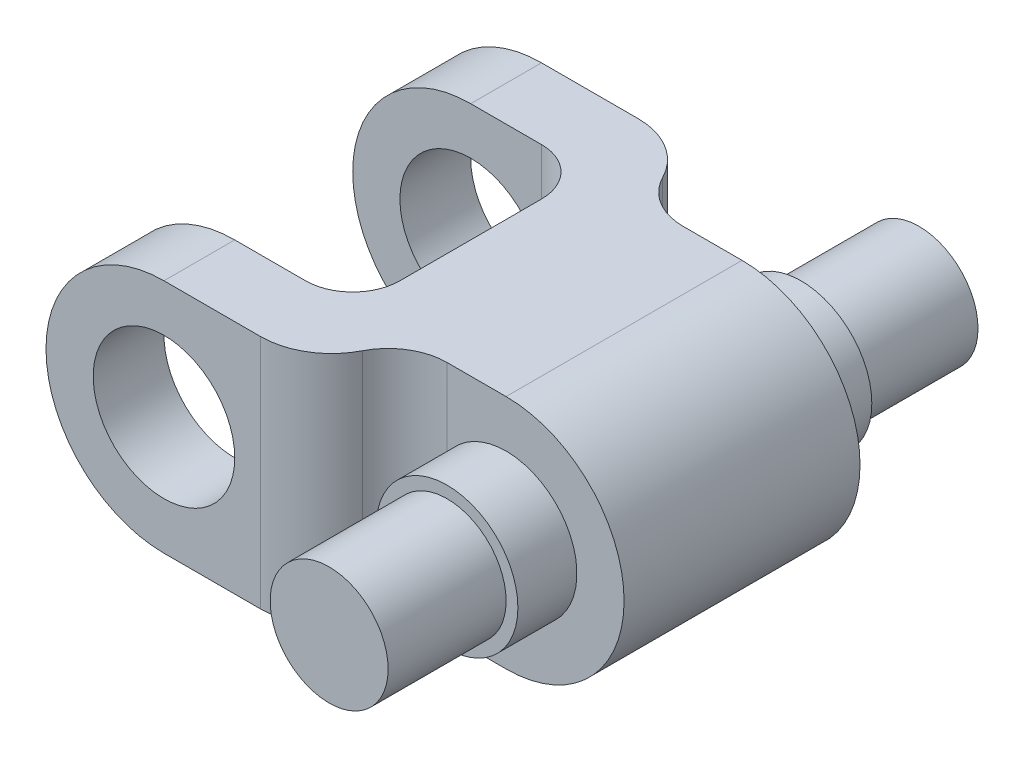
ISO-10303-21;
HEADER;
FILE_DESCRIPTION(('STEP AP214'),'2;1');
FILE_NAME('part.step','',(''),(''),'','','');
FILE_SCHEMA(('AUTOMOTIVE_DESIGN { 1 0 10303 214 1 1 1 1 }'));
ENDSEC;
DATA;
#1=APPLICATION_CONTEXT('core data for automotive mechanical design processes');
#2=APPLICATION_PROTOCOL_DEFINITION('international standard','automotive_design',2000,#1);
#3=PRODUCT_CONTEXT('',#1,'mechanical');
#4=PRODUCT('Part','Part','',(#3));
#5=PRODUCT_RELATED_PRODUCT_CATEGORY('part','',(#4));
#6=PRODUCT_DEFINITION_FORMATION('','',#4);
#7=PRODUCT_DEFINITION_CONTEXT('part definition',#1,'design');
#8=PRODUCT_DEFINITION('design','',#6,#7);
#9=PRODUCT_DEFINITION_SHAPE('','',#8);
#10=(LENGTH_UNIT() NAMED_UNIT(*) SI_UNIT(.MILLI.,.METRE.));
#11=(NAMED_UNIT(*) PLANE_ANGLE_UNIT() SI_UNIT($,.RADIAN.));
#12=(NAMED_UNIT(*) SI_UNIT($,.STERADIAN.) SOLID_ANGLE_UNIT());
#13=UNCERTAINTY_MEASURE_WITH_UNIT(LENGTH_MEASURE(1.E-05),#10,'distance_accuracy_value','');
#14=(GEOMETRIC_REPRESENTATION_CONTEXT(3) GLOBAL_UNCERTAINTY_ASSIGNED_CONTEXT((#13)) GLOBAL_UNIT_ASSIGNED_CONTEXT((#10,
#11,#12)) REPRESENTATION_CONTEXT('',''));
#15=CARTESIAN_POINT('',(0.,0.,0.));
#16=DIRECTION('',(0.,0.,1.));
#17=DIRECTION('',(1.,0.,0.));
#18=AXIS2_PLACEMENT_3D('',#15,#16,#17);
#19=CARTESIAN_POINT('',(-11.5,0.,8.));
#20=DIRECTION('',(0.,0.,-1.));
#21=DIRECTION('',(-1.,0.,0.));
#22=AXIS2_PLACEMENT_3D('',#19,#20,#21);
#23=CYLINDRICAL_SURFACE('',#22,5.);
#24=DIRECTION('',(0.,0.,-1.));
#25=VECTOR('',#24,1.);
#26=CARTESIAN_POINT('',(-11.5,5.,8.));
#27=LINE('',#26,#25);
#28=CARTESIAN_POINT('',(-11.5,5.,8.));
#29=VERTEX_POINT('',#28);
#30=CARTESIAN_POINT('',(-11.5,5.,5.));
#31=VERTEX_POINT('',#30);
#32=EDGE_CURVE('E197',#29,#31,#27,.T.);
#33=ORIENTED_EDGE('',*,*,#32,.T.);
#34=CARTESIAN_POINT('',(-11.5,0.,5.));
#35=DIRECTION('',(0.,0.,-1.));
#36=DIRECTION('',(-1.,0.,0.));
#37=AXIS2_PLACEMENT_3D('',#34,#35,#36);
#38=CIRCLE('',#37,5.);
#39=CARTESIAN_POINT('',(-11.5,-5.,5.));
#40=VERTEX_POINT('',#39);
#41=EDGE_CURVE('E179',#40,#31,#38,.T.);
#42=ORIENTED_EDGE('',*,*,#41,.F.);
#43=DIRECTION('',(0.,0.,-1.));
#44=VECTOR('',#43,1.);
#45=CARTESIAN_POINT('',(-11.5,-5.,8.));
#46=LINE('',#45,#44);
#47=CARTESIAN_POINT('',(-11.5,-5.,8.));
#48=VERTEX_POINT('',#47);
#49=EDGE_CURVE('E185',#48,#40,#46,.T.);
#50=ORIENTED_EDGE('',*,*,#49,.F.);
#51=CARTESIAN_POINT('',(-11.5,0.,8.));
#52=DIRECTION('',(0.,0.,1.));
#53=DIRECTION('',(1.,0.,0.));
#54=AXIS2_PLACEMENT_3D('',#51,#52,#53);
#55=CIRCLE('',#54,5.);
#56=EDGE_CURVE('E191',#29,#48,#55,.T.);
#57=ORIENTED_EDGE('',*,*,#56,.F.);
#58=EDGE_LOOP('',(#33,#42,#50,#57));
#59=FACE_BOUND('',#58,.T.);
#60=ADVANCED_FACE('F32',(#59),#23,.T.);
#61=CARTESIAN_POINT('',(0.,0.,5.));
#62=DIRECTION('',(0.,0.,-1.));
#63=DIRECTION('',(-1.,0.,0.));
#64=AXIS2_PLACEMENT_3D('',#61,#62,#63);
#65=CYLINDRICAL_SURFACE('',#64,5.);
#66=CARTESIAN_POINT('',(0.,0.,-5.));
#67=DIRECTION('',(0.,0.,1.));
#68=DIRECTION('',(1.,0.,0.));
#69=AXIS2_PLACEMENT_3D('',#66,#67,#68);
#70=CIRCLE('',#69,5.);
#71=CARTESIAN_POINT('',(0.,5.,-5.));
#72=VERTEX_POINT('',#71);
#73=CARTESIAN_POINT('',(0.,-5.,-5.));
#74=VERTEX_POINT('',#73);
#75=EDGE_CURVE('E220',#72,#74,#70,.F.);
#76=ORIENTED_EDGE('',*,*,#75,.F.);
#77=DIRECTION('',(0.,0.,-1.));
#78=VECTOR('',#77,1.);
#79=CARTESIAN_POINT('',(0.,5.,5.));
#80=LINE('',#79,#78);
#81=CARTESIAN_POINT('',(0.,5.,5.));
#82=VERTEX_POINT('',#81);
#83=EDGE_CURVE('E210',#82,#72,#80,.T.);
#84=ORIENTED_EDGE('',*,*,#83,.F.);
#85=CARTESIAN_POINT('',(0.,0.,5.));
#86=DIRECTION('',(0.,0.,1.));
#87=DIRECTION('',(1.,0.,0.));
#88=AXIS2_PLACEMENT_3D('',#85,#86,#87);
#89=CIRCLE('',#88,5.);
#90=CARTESIAN_POINT('',(0.,-5.,5.));
#91=VERTEX_POINT('',#90);
#92=EDGE_CURVE('E224',#82,#91,#89,.F.);
#93=ORIENTED_EDGE('',*,*,#92,.T.);
#94=DIRECTION('',(0.,0.,-1.));
#95=VECTOR('',#94,1.);
#96=CARTESIAN_POINT('',(0.,-5.,5.));
#97=LINE('',#96,#95);
#98=EDGE_CURVE('E233',#91,#74,#97,.T.);
#99=ORIENTED_EDGE('',*,*,#98,.T.);
#100=EDGE_LOOP('',(#76,#84,#93,#99));
#101=FACE_BOUND('',#100,.T.);
#102=ADVANCED_FACE('F313',(#101),#65,.T.);
#103=CARTESIAN_POINT('',(0.,5.,5.));
#104=DIRECTION('',(0.,-1.,0.));
#105=DIRECTION('',(0.,0.,-1.));
#106=AXIS2_PLACEMENT_3D('',#103,#104,#105);
#107=PLANE('',#106);
#108=CARTESIAN_POINT('',(-2.5,5.,-7.5));
#109=DIRECTION('',(0.,-1.,0.));
#110=DIRECTION('',(0.,0.,-1.));
#111=AXIS2_PLACEMENT_3D('',#108,#109,#110);
#112=CIRCLE('',#111,2.5);
#113=CARTESIAN_POINT('',(-2.5,5.,-5.));
#114=VERTEX_POINT('',#113);
#115=CARTESIAN_POINT('',(-4.72680885707562,5.,-6.36363636363636));
#116=VERTEX_POINT('',#115);
#117=EDGE_CURVE('E618',#114,#116,#112,.T.);
#118=ORIENTED_EDGE('',*,*,#117,.T.);
#119=CARTESIAN_POINT('',(-7.39897948556636,5.,-5.));
#120=DIRECTION('',(0.,-1.,0.));
#121=DIRECTION('',(0.,0.,-1.));
#122=AXIS2_PLACEMENT_3D('',#119,#120,#121);
#123=CIRCLE('',#122,3.);
#124=CARTESIAN_POINT('',(-7.39897948556636,5.,-8.));
#125=VERTEX_POINT('',#124);
#126=EDGE_CURVE('E615',#116,#125,#123,.F.);
#127=ORIENTED_EDGE('',*,*,#126,.T.);
#128=DIRECTION('',(-1.,0.,0.));
#129=VECTOR('',#128,1.);
#130=CARTESIAN_POINT('',(-5.,5.,-8.));
#131=LINE('',#130,#129);
#132=CARTESIAN_POINT('',(-11.5,5.,-8.));
#133=VERTEX_POINT('',#132);
#134=EDGE_CURVE('E554',#125,#133,#131,.T.);
#135=ORIENTED_EDGE('',*,*,#134,.T.);
#136=CARTESIAN_POINT('',(-11.5,5.,-5.));
#137=VERTEX_POINT('',#136);
#138=EDGE_CURVE('E189',#137,#133,#27,.T.);
#139=ORIENTED_EDGE('',*,*,#138,.F.);
#140=DIRECTION('',(1.,0.,0.));
#141=VECTOR('',#140,1.);
#142=CARTESIAN_POINT('',(0.,5.,-5.));
#143=LINE('',#142,#141);
#144=CARTESIAN_POINT('',(-8.5,5.,-5.));
#145=VERTEX_POINT('',#144);
#146=EDGE_CURVE('E174',#137,#145,#143,.T.);
#147=ORIENTED_EDGE('',*,*,#146,.T.);
#148=CARTESIAN_POINT('',(-8.5,5.,-3.));
#149=DIRECTION('',(0.,-1.,0.));
#150=DIRECTION('',(0.,0.,-1.));
#151=AXIS2_PLACEMENT_3D('',#148,#149,#150);
#152=CIRCLE('',#151,2.);
#153=CARTESIAN_POINT('',(-6.5,5.,-3.));
#154=VERTEX_POINT('',#153);
#155=EDGE_CURVE('E40',#145,#154,#152,.T.);
#156=ORIENTED_EDGE('',*,*,#155,.T.);
#157=DIRECTION('',(0.,0.,-1.));
#158=VECTOR('',#157,1.);
#159=CARTESIAN_POINT('',(-6.5,5.,5.));
#160=LINE('',#159,#158);
#161=CARTESIAN_POINT('',(-6.5,5.,3.));
#162=VERTEX_POINT('',#161);
#163=EDGE_CURVE('E551',#162,#154,#160,.T.);
#164=ORIENTED_EDGE('',*,*,#163,.F.);
#165=CARTESIAN_POINT('',(-8.5,5.,3.));
#166=DIRECTION('',(0.,-1.,0.));
#167=DIRECTION('',(0.,0.,-1.));
#168=AXIS2_PLACEMENT_3D('',#165,#166,#167);
#169=CIRCLE('',#168,2.);
#170=CARTESIAN_POINT('',(-8.5,5.,5.));
#171=VERTEX_POINT('',#170);
#172=EDGE_CURVE('E589',#162,#171,#169,.T.);
#173=ORIENTED_EDGE('',*,*,#172,.T.);
#174=DIRECTION('',(1.,0.,0.));
#175=VECTOR('',#174,1.);
#176=CARTESIAN_POINT('',(0.,5.,5.));
#177=LINE('',#176,#175);
#178=EDGE_CURVE('E547',#31,#171,#177,.T.);
#179=ORIENTED_EDGE('',*,*,#178,.F.);
#180=ORIENTED_EDGE('',*,*,#32,.F.);
#181=DIRECTION('',(-1.,0.,0.));
#182=VECTOR('',#181,1.);
#183=CARTESIAN_POINT('',(-5.,5.,8.));
#184=LINE('',#183,#182);
#185=CARTESIAN_POINT('',(-7.39897948556636,5.,8.));
#186=VERTEX_POINT('',#185);
#187=EDGE_CURVE('E555',#186,#29,#184,.T.);
#188=ORIENTED_EDGE('',*,*,#187,.F.);
#189=CARTESIAN_POINT('',(-7.39897948556636,5.,5.));
#190=DIRECTION('',(0.,-1.,0.));
#191=DIRECTION('',(0.,0.,-1.));
#192=AXIS2_PLACEMENT_3D('',#189,#190,#191);
#193=CIRCLE('',#192,3.);
#194=CARTESIAN_POINT('',(-4.72680885707562,5.,6.36363636363636));
#195=VERTEX_POINT('',#194);
#196=EDGE_CURVE('E613',#186,#195,#193,.F.);
#197=ORIENTED_EDGE('',*,*,#196,.T.);
#198=CARTESIAN_POINT('',(-2.5,5.,7.5));
#199=DIRECTION('',(0.,-1.,0.));
#200=DIRECTION('',(0.,0.,-1.));
#201=AXIS2_PLACEMENT_3D('',#198,#199,#200);
#202=CIRCLE('',#201,2.5);
#203=CARTESIAN_POINT('',(-2.5,5.,5.));
#204=VERTEX_POINT('',#203);
#205=EDGE_CURVE('E628',#195,#204,#202,.T.);
#206=ORIENTED_EDGE('',*,*,#205,.T.);
#207=DIRECTION('',(-1.,0.,0.));
#208=VECTOR('',#207,1.);
#209=CARTESIAN_POINT('',(0.,5.,5.));
#210=LINE('',#209,#208);
#211=EDGE_CURVE('E228',#82,#204,#210,.T.);
#212=ORIENTED_EDGE('',*,*,#211,.F.);
#213=ORIENTED_EDGE('',*,*,#83,.T.);
#214=DIRECTION('',(-1.,0.,0.));
#215=VECTOR('',#214,1.);
#216=CARTESIAN_POINT('',(0.,5.,-5.));
#217=LINE('',#216,#215);
#218=EDGE_CURVE('E236',#72,#114,#217,.T.);
#219=ORIENTED_EDGE('',*,*,#218,.T.);
#220=EDGE_LOOP('',(#118,#127,#135,#139,#147,#156,#164,#173,#179,#180,#188,#197,#206,#212,#213,#219));
#221=FACE_BOUND('',#220,.T.);
#222=ADVANCED_FACE('F319',(#221),#107,.F.);
#223=CARTESIAN_POINT('',(0.,-5.,5.));
#224=DIRECTION('',(0.,1.,0.));
#225=DIRECTION('',(0.,0.,1.));
#226=AXIS2_PLACEMENT_3D('',#223,#224,#225);
#227=PLANE('',#226);
#228=DIRECTION('',(1.,0.,0.));
#229=VECTOR('',#228,1.);
#230=CARTESIAN_POINT('',(-11.5,-5.,-8.));
#231=LINE('',#230,#229);
#232=CARTESIAN_POINT('',(-11.5,-5.,-8.));
#233=VERTEX_POINT('',#232);
#234=CARTESIAN_POINT('',(-7.39897948556636,-5.,-8.));
#235=VERTEX_POINT('',#234);
#236=EDGE_CURVE('E195',#233,#235,#231,.T.);
#237=ORIENTED_EDGE('',*,*,#236,.T.);
#238=CARTESIAN_POINT('',(-7.39897948556636,-5.,-5.));
#239=DIRECTION('',(0.,1.,0.));
#240=DIRECTION('',(0.,0.,1.));
#241=AXIS2_PLACEMENT_3D('',#238,#239,#240);
#242=CIRCLE('',#241,3.);
#243=CARTESIAN_POINT('',(-4.72680885707562,-5.,-6.36363636363636));
#244=VERTEX_POINT('',#243);
#245=EDGE_CURVE('E559',#235,#244,#242,.F.);
#246=ORIENTED_EDGE('',*,*,#245,.T.);
#247=CARTESIAN_POINT('',(-2.5,-5.,-7.5));
#248=DIRECTION('',(0.,1.,0.));
#249=DIRECTION('',(0.,0.,1.));
#250=AXIS2_PLACEMENT_3D('',#247,#248,#249);
#251=CIRCLE('',#250,2.5);
#252=CARTESIAN_POINT('',(-2.5,-5.,-5.));
#253=VERTEX_POINT('',#252);
#254=EDGE_CURVE('E625',#244,#253,#251,.T.);
#255=ORIENTED_EDGE('',*,*,#254,.T.);
#256=DIRECTION('',(1.,0.,0.));
#257=VECTOR('',#256,1.);
#258=CARTESIAN_POINT('',(0.,-5.,-5.));
#259=LINE('',#258,#257);
#260=EDGE_CURVE('E225',#253,#74,#259,.T.);
#261=ORIENTED_EDGE('',*,*,#260,.T.);
#262=ORIENTED_EDGE('',*,*,#98,.F.);
#263=DIRECTION('',(1.,0.,0.));
#264=VECTOR('',#263,1.);
#265=CARTESIAN_POINT('',(0.,-5.,5.));
#266=LINE('',#265,#264);
#267=CARTESIAN_POINT('',(-2.5,-5.,5.));
#268=VERTEX_POINT('',#267);
#269=EDGE_CURVE('E231',#268,#91,#266,.T.);
#270=ORIENTED_EDGE('',*,*,#269,.F.);
#271=CARTESIAN_POINT('',(-2.5,-5.,7.5));
#272=DIRECTION('',(0.,1.,0.));
#273=DIRECTION('',(0.,0.,1.));
#274=AXIS2_PLACEMENT_3D('',#271,#272,#273);
#275=CIRCLE('',#274,2.5);
#276=CARTESIAN_POINT('',(-4.72680885707562,-5.,6.36363636363636));
#277=VERTEX_POINT('',#276);
#278=EDGE_CURVE('E289',#268,#277,#275,.T.);
#279=ORIENTED_EDGE('',*,*,#278,.T.);
#280=CARTESIAN_POINT('',(-7.39897948556636,-5.,5.));
#281=DIRECTION('',(0.,1.,0.));
#282=DIRECTION('',(0.,0.,1.));
#283=AXIS2_PLACEMENT_3D('',#280,#281,#282);
#284=CIRCLE('',#283,3.);
#285=CARTESIAN_POINT('',(-7.39897948556636,-5.,8.));
#286=VERTEX_POINT('',#285);
#287=EDGE_CURVE('E568',#277,#286,#284,.F.);
#288=ORIENTED_EDGE('',*,*,#287,.T.);
#289=DIRECTION('',(1.,0.,0.));
#290=VECTOR('',#289,1.);
#291=CARTESIAN_POINT('',(-11.5,-5.,8.));
#292=LINE('',#291,#290);
#293=EDGE_CURVE('E186',#48,#286,#292,.T.);
#294=ORIENTED_EDGE('',*,*,#293,.F.);
#295=ORIENTED_EDGE('',*,*,#49,.T.);
#296=DIRECTION('',(-1.,0.,0.));
#297=VECTOR('',#296,1.);
#298=CARTESIAN_POINT('',(-6.5,-5.,5.));
#299=LINE('',#298,#297);
#300=CARTESIAN_POINT('',(-8.5,-5.,5.));
#301=VERTEX_POINT('',#300);
#302=EDGE_CURVE('E169',#301,#40,#299,.T.);
#303=ORIENTED_EDGE('',*,*,#302,.F.);
#304=CARTESIAN_POINT('',(-8.5,-5.,3.));
#305=DIRECTION('',(0.,1.,0.));
#306=DIRECTION('',(0.,0.,1.));
#307=AXIS2_PLACEMENT_3D('',#304,#305,#306);
#308=CIRCLE('',#307,2.);
#309=CARTESIAN_POINT('',(-6.5,-5.,3.));
#310=VERTEX_POINT('',#309);
#311=EDGE_CURVE('E591',#301,#310,#308,.T.);
#312=ORIENTED_EDGE('',*,*,#311,.T.);
#313=DIRECTION('',(0.,0.,1.));
#314=VECTOR('',#313,1.);
#315=CARTESIAN_POINT('',(-6.5,-5.,-5.));
#316=LINE('',#315,#314);
#317=CARTESIAN_POINT('',(-6.5,-5.,-3.));
#318=VERTEX_POINT('',#317);
#319=EDGE_CURVE('E544',#318,#310,#316,.T.);
#320=ORIENTED_EDGE('',*,*,#319,.F.);
#321=CARTESIAN_POINT('',(-8.5,-5.,-3.));
#322=DIRECTION('',(0.,1.,0.));
#323=DIRECTION('',(0.,0.,1.));
#324=AXIS2_PLACEMENT_3D('',#321,#322,#323);
#325=CIRCLE('',#324,2.);
#326=CARTESIAN_POINT('',(-8.5,-5.,-5.));
#327=VERTEX_POINT('',#326);
#328=EDGE_CURVE('E11',#318,#327,#325,.T.);
#329=ORIENTED_EDGE('',*,*,#328,.T.);
#330=DIRECTION('',(-1.,0.,0.));
#331=VECTOR('',#330,1.);
#332=CARTESIAN_POINT('',(-6.5,-5.,-5.));
#333=LINE('',#332,#331);
#334=CARTESIAN_POINT('',(-11.5,-5.,-5.));
#335=VERTEX_POINT('',#334);
#336=EDGE_CURVE('E160',#327,#335,#333,.T.);
#337=ORIENTED_EDGE('',*,*,#336,.T.);
#338=EDGE_CURVE('E165',#335,#233,#46,.T.);
#339=ORIENTED_EDGE('',*,*,#338,.T.);
#340=EDGE_LOOP('',(#237,#246,#255,#261,#262,#270,#279,#288,#294,#295,#303,#312,#320,#329,#337,#339));
#341=FACE_BOUND('',#340,.T.);
#342=ADVANCED_FACE('F163',(#341),#227,.F.);
#343=CARTESIAN_POINT('',(0.,0.,5.));
#344=DIRECTION('',(0.,0.,1.));
#345=DIRECTION('',(1.,0.,0.));
#346=AXIS2_PLACEMENT_3D('',#343,#344,#345);
#347=PLANE('',#346);
#348=ORIENTED_EDGE('',*,*,#211,.T.);
#349=DIRECTION('',(0.,-1.,0.));
#350=VECTOR('',#349,1.);
#351=CARTESIAN_POINT('',(-2.5,0.,5.));
#352=LINE('',#351,#350);
#353=CARTESIAN_POINT('',(-2.5,1.6583123951777,5.));
#354=VERTEX_POINT('',#353);
#355=EDGE_CURVE('E252',#204,#354,#352,.T.);
#356=ORIENTED_EDGE('',*,*,#355,.T.);
#357=CARTESIAN_POINT('',(0.,0.,5.));
#358=DIRECTION('',(0.,0.,1.));
#359=DIRECTION('',(1.,0.,0.));
#360=AXIS2_PLACEMENT_3D('',#357,#358,#359);
#361=CIRCLE('',#360,3.);
#362=CARTESIAN_POINT('',(-2.5,-1.6583123951777,5.));
#363=VERTEX_POINT('',#362);
#364=EDGE_CURVE('E221',#363,#354,#361,.T.);
#365=ORIENTED_EDGE('',*,*,#364,.F.);
#366=DIRECTION('',(0.,-1.,0.));
#367=VECTOR('',#366,1.);
#368=CARTESIAN_POINT('',(-2.5,0.,5.));
#369=LINE('',#368,#367);
#370=EDGE_CURVE('E178',#363,#268,#369,.T.);
#371=ORIENTED_EDGE('',*,*,#370,.T.);
#372=ORIENTED_EDGE('',*,*,#269,.T.);
#373=ORIENTED_EDGE('',*,*,#92,.F.);
#374=EDGE_LOOP('',(#348,#356,#365,#371,#372,#373));
#375=FACE_BOUND('',#374,.T.);
#376=ADVANCED_FACE('F279',(#375),#347,.T.);
#377=CARTESIAN_POINT('',(0.,0.,-5.));
#378=DIRECTION('',(0.,0.,1.));
#379=DIRECTION('',(1.,0.,0.));
#380=AXIS2_PLACEMENT_3D('',#377,#378,#379);
#381=PLANE('',#380);
#382=ORIENTED_EDGE('',*,*,#260,.F.);
#383=DIRECTION('',(0.,-1.,0.));
#384=VECTOR('',#383,1.);
#385=CARTESIAN_POINT('',(-2.5,5.,-5.));
#386=LINE('',#385,#384);
#387=CARTESIAN_POINT('',(-2.5,-1.6583123951777,-5.));
#388=VERTEX_POINT('',#387);
#389=EDGE_CURVE('E290',#253,#388,#386,.F.);
#390=ORIENTED_EDGE('',*,*,#389,.T.);
#391=CARTESIAN_POINT('',(0.,0.,-5.));
#392=DIRECTION('',(0.,0.,1.));
#393=DIRECTION('',(1.,0.,0.));
#394=AXIS2_PLACEMENT_3D('',#391,#392,#393);
#395=CIRCLE('',#394,3.);
#396=CARTESIAN_POINT('',(-2.5,1.6583123951777,-5.));
#397=VERTEX_POINT('',#396);
#398=EDGE_CURVE('E214',#397,#388,#395,.F.);
#399=ORIENTED_EDGE('',*,*,#398,.F.);
#400=DIRECTION('',(0.,-1.,0.));
#401=VECTOR('',#400,1.);
#402=CARTESIAN_POINT('',(-2.5,5.,-5.));
#403=LINE('',#402,#401);
#404=EDGE_CURVE('E263',#397,#114,#403,.F.);
#405=ORIENTED_EDGE('',*,*,#404,.T.);
#406=ORIENTED_EDGE('',*,*,#218,.F.);
#407=ORIENTED_EDGE('',*,*,#75,.T.);
#408=EDGE_LOOP('',(#382,#390,#399,#405,#406,#407));
#409=FACE_BOUND('',#408,.T.);
#410=ADVANCED_FACE('F394',(#409),#381,.F.);
#411=CARTESIAN_POINT('',(0.,0.,-7.5));
#412=DIRECTION('',(0.,0.,1.));
#413=DIRECTION('',(1.,0.,0.));
#414=AXIS2_PLACEMENT_3D('',#411,#412,#413);
#415=PLANE('',#414);
#416=CARTESIAN_POINT('',(0.,0.,-7.5));
#417=DIRECTION('',(0.,0.,1.));
#418=DIRECTION('',(1.,0.,0.));
#419=AXIS2_PLACEMENT_3D('',#416,#417,#418);
#420=CIRCLE('',#419,2.5);
#421=CARTESIAN_POINT('',(2.5,0.,-7.5));
#422=VERTEX_POINT('',#421);
#423=EDGE_CURVE('E207',#422,#422,#420,.F.);
#424=ORIENTED_EDGE('',*,*,#423,.F.);
#425=EDGE_LOOP('',(#424));
#426=FACE_BOUND('',#425,.T.);
#427=CARTESIAN_POINT('',(0.,0.,-7.5));
#428=DIRECTION('',(0.,0.,1.));
#429=DIRECTION('',(1.,0.,0.));
#430=AXIS2_PLACEMENT_3D('',#427,#428,#429);
#431=CIRCLE('',#430,3.);
#432=CARTESIAN_POINT('',(3.,0.,-7.5));
#433=VERTEX_POINT('',#432);
#434=EDGE_CURVE('E215',#433,#433,#431,.T.);
#435=ORIENTED_EDGE('',*,*,#434,.F.);
#436=EDGE_LOOP('',(#435));
#437=FACE_BOUND('',#436,.T.);
#438=ADVANCED_FACE('F277',(#426,#437),#415,.F.);
#439=CARTESIAN_POINT('',(0.,0.,7.5));
#440=DIRECTION('',(0.,0.,-1.));
#441=DIRECTION('',(-1.,0.,0.));
#442=AXIS2_PLACEMENT_3D('',#439,#440,#441);
#443=CYLINDRICAL_SURFACE('',#442,3.);
#444=ORIENTED_EDGE('',*,*,#434,.T.);
#445=EDGE_LOOP('',(#444));
#446=FACE_BOUND('',#445,.T.);
#447=ORIENTED_EDGE('',*,*,#398,.T.);
#448=CARTESIAN_POINT('',(-2.5,-1.6583123951777,-5.));
#449=CARTESIAN_POINT('',(-2.54640522705319,-1.58836978850516,-5.00001572629355));
#450=CARTESIAN_POINT('',(-2.58984807398269,-1.51648932769973,-5.00129254377211));
#451=CARTESIAN_POINT('',(-2.67053702381544,-1.36939851337473,-5.00549209947799));
#452=CARTESIAN_POINT('',(-2.70778480743612,-1.29418907004014,-5.0084143903426));
#453=CARTESIAN_POINT('',(-2.77583829409375,-1.14094494694656,-5.01502970267162));
#454=CARTESIAN_POINT('',(-2.8066437806177,-1.06291017233708,-5.01872275003131));
#455=CARTESIAN_POINT('',(-2.86161584762196,-0.904533038224864,-5.02613556967114));
#456=CARTESIAN_POINT('',(-2.88578213410312,-0.824190576706349,-5.0298553431273));
#457=CARTESIAN_POINT('',(-2.92731098853541,-0.661726092470956,-5.03669965626383));
#458=CARTESIAN_POINT('',(-2.94467245947933,-0.579603785074426,-5.03982409992915));
#459=CARTESIAN_POINT('',(-2.97245806111637,-0.414159970680964,-5.04500839416113));
#460=CARTESIAN_POINT('',(-2.98288228560909,-0.33083847991394,-5.04706825912205));
#461=CARTESIAN_POINT('',(-2.99670751542838,-0.163636811215961,-5.04983029165186));
#462=CARTESIAN_POINT('',(-3.00011231578196,-0.0797569597840993,-5.05053319284536));
#463=CARTESIAN_POINT('',(-2.99988203502918,0.0879904428916179,-5.05048616833434));
#464=CARTESIAN_POINT('',(-2.99624715732539,0.171857994420842,-5.0497362846062));
#465=CARTESIAN_POINT('',(-2.98203158996823,0.33822412958058,-5.04690051183987));
#466=CARTESIAN_POINT('',(-2.97151312283893,0.42072825178811,-5.04482659514362));
#467=CARTESIAN_POINT('',(-2.94366662803994,0.584581907524242,-5.03964230190601));
#468=CARTESIAN_POINT('',(-2.92633561282084,0.665930918255756,-5.03653147073117));
#469=CARTESIAN_POINT('',(-2.88500358934479,0.826830509697308,-5.0297347809123));
#470=CARTESIAN_POINT('',(-2.86100720063047,0.906382294859733,-5.02604932129686));
#471=CARTESIAN_POINT('',(-2.80650063178734,1.06322552640419,-5.01870766800087));
#472=CARTESIAN_POINT('',(-2.77599024448382,1.14051690080599,-5.01505147525498));
#473=CARTESIAN_POINT('',(-2.70820188252596,1.29333555771464,-5.00844791592659));
#474=CARTESIAN_POINT('',(-2.67083990486637,1.36882609526602,-5.00551054114608));
#475=CARTESIAN_POINT('',(-2.58996734617628,1.51629210626999,-5.00129612527599));
#476=CARTESIAN_POINT('',(-2.54646886171759,1.58827412899312,-5.00001586694589));
#477=CARTESIAN_POINT('',(-2.5,1.6583123951777,-5.));
#478=B_SPLINE_CURVE_WITH_KNOTS('',3,(#448,#449,#450,#451,#452,#453,#454,#455,#456,#457,#458,
#459,#460,#461,#462,#463,#464,#465,#466,#467,#468,#469,#470,#471,#472,#473,#474,#475,#476,#477),
.UNSPECIFIED.,.F.,.F.,(4,2,2,2,2,2,2,2,2,2,2,2,2,2,4),(0.,0.251696090435493,0.50332378407231,
0.754959933064418,1.00660722329289,1.25829506501896,1.50997950356531,1.7615278340818,
2.01306889653637,2.26236704988674,2.51177465170526,2.76100982709346,3.0102529304728,
3.26278549861641,3.51482704350553),.UNSPECIFIED.);
#479=EDGE_CURVE('E283',#388,#397,#478,.T.);
#480=ORIENTED_EDGE('',*,*,#479,.T.);
#481=EDGE_LOOP('',(#447,#480));
#482=FACE_BOUND('',#481,.T.);
#483=ADVANCED_FACE('F275',(#446,#482),#443,.T.);
#484=ORIENTED_EDGE('',*,*,#364,.T.);
#485=CARTESIAN_POINT('',(-2.5,1.6583123951777,5.));
#486=CARTESIAN_POINT('',(-2.54640522705319,1.58836978850516,5.00001572629355));
#487=CARTESIAN_POINT('',(-2.58984807398269,1.51648932769973,5.00129254377211));
#488=CARTESIAN_POINT('',(-2.67053702381544,1.36939851337473,5.00549209947799));
#489=CARTESIAN_POINT('',(-2.70778480743612,1.29418907004014,5.0084143903426));
#490=CARTESIAN_POINT('',(-2.77583829409375,1.14094494694656,5.01502970267162));
#491=CARTESIAN_POINT('',(-2.8066437806177,1.06291017233708,5.01872275003131));
#492=CARTESIAN_POINT('',(-2.86161584762196,0.904533038224863,5.02613556967114));
#493=CARTESIAN_POINT('',(-2.88578213410312,0.824190576706348,5.0298553431273));
#494=CARTESIAN_POINT('',(-2.92731098853541,0.661726092470955,5.03669965626383));
#495=CARTESIAN_POINT('',(-2.94467245947933,0.579603785074425,5.03982409992915));
#496=CARTESIAN_POINT('',(-2.97245806111637,0.414159970680963,5.04500839416113));
#497=CARTESIAN_POINT('',(-2.98288228560909,0.330838479913939,5.04706825912205));
#498=CARTESIAN_POINT('',(-2.99670751542838,0.16363681121596,5.04983029165186));
#499=CARTESIAN_POINT('',(-3.00011231578196,0.0797569597840981,5.05053319284536));
#500=CARTESIAN_POINT('',(-2.99988203502918,-0.087990442891619,5.05048616833434));
#501=CARTESIAN_POINT('',(-2.99624715732539,-0.171857994420843,5.0497362846062));
#502=CARTESIAN_POINT('',(-2.98203158996823,-0.338224129580581,5.04690051183987));
#503=CARTESIAN_POINT('',(-2.97151312283893,-0.420728251788112,5.04482659514362));
#504=CARTESIAN_POINT('',(-2.94366662803994,-0.584581907524244,5.03964230190601));
#505=CARTESIAN_POINT('',(-2.92633561282084,-0.665930918255757,5.03653147073117));
#506=CARTESIAN_POINT('',(-2.88500358934479,-0.826830509697309,5.0297347809123));
#507=CARTESIAN_POINT('',(-2.86100720063047,-0.906382294859735,5.02604932129686));
#508=CARTESIAN_POINT('',(-2.80650063178734,-1.06322552640419,5.01870766800087));
#509=CARTESIAN_POINT('',(-2.77599024448382,-1.14051690080599,5.01505147525498));
#510=CARTESIAN_POINT('',(-2.70820188252596,-1.29333555771464,5.00844791592659));
#511=CARTESIAN_POINT('',(-2.67083990486637,-1.36882609526603,5.00551054114608));
#512=CARTESIAN_POINT('',(-2.58996734617628,-1.51629210626999,5.00129612527599));
#513=CARTESIAN_POINT('',(-2.54646886171759,-1.58827412899313,5.00001586694589));
#514=CARTESIAN_POINT('',(-2.5,-1.6583123951777,5.));
#515=B_SPLINE_CURVE_WITH_KNOTS('',3,(#485,#486,#487,#488,#489,#490,#491,#492,#493,#494,#495,
#496,#497,#498,#499,#500,#501,#502,#503,#504,#505,#506,#507,#508,#509,#510,#511,#512,#513,#514),
.UNSPECIFIED.,.F.,.F.,(4,2,2,2,2,2,2,2,2,2,2,2,2,2,4),(0.,0.251696090435492,0.50332378407231,
0.754959933064418,1.00660722329289,1.25829506501896,1.50997950356531,1.7615278340818,
2.01306889653637,2.26236704988674,2.51177465170526,2.76100982709346,3.0102529304728,
3.26278549861641,3.51482704350553),.UNSPECIFIED.);
#516=EDGE_CURVE('E255',#354,#363,#515,.T.);
#517=ORIENTED_EDGE('',*,*,#516,.T.);
#518=EDGE_LOOP('',(#484,#517));
#519=FACE_BOUND('',#518,.T.);
#520=CARTESIAN_POINT('',(0.,0.,7.5));
#521=DIRECTION('',(0.,0.,1.));
#522=DIRECTION('',(1.,0.,0.));
#523=AXIS2_PLACEMENT_3D('',#520,#521,#522);
#524=CIRCLE('',#523,3.);
#525=CARTESIAN_POINT('',(3.,0.,7.5));
#526=VERTEX_POINT('',#525);
#527=EDGE_CURVE('E211',#526,#526,#524,.T.);
#528=ORIENTED_EDGE('',*,*,#527,.F.);
#529=EDGE_LOOP('',(#528));
#530=FACE_BOUND('',#529,.T.);
#531=ADVANCED_FACE('F269',(#519,#530),#443,.T.);
#532=CARTESIAN_POINT('',(0.,0.,7.5));
#533=DIRECTION('',(0.,0.,1.));
#534=DIRECTION('',(1.,0.,0.));
#535=AXIS2_PLACEMENT_3D('',#532,#533,#534);
#536=PLANE('',#535);
#537=CARTESIAN_POINT('',(0.,0.,7.5));
#538=DIRECTION('',(0.,0.,1.));
#539=DIRECTION('',(1.,0.,0.));
#540=AXIS2_PLACEMENT_3D('',#537,#538,#539);
#541=CIRCLE('',#540,2.5);
#542=CARTESIAN_POINT('',(2.5,0.,7.5));
#543=VERTEX_POINT('',#542);
#544=EDGE_CURVE('E204',#543,#543,#541,.F.);
#545=ORIENTED_EDGE('',*,*,#544,.T.);
#546=EDGE_LOOP('',(#545));
#547=FACE_BOUND('',#546,.T.);
#548=ORIENTED_EDGE('',*,*,#527,.T.);
#549=EDGE_LOOP('',(#548));
#550=FACE_BOUND('',#549,.T.);
#551=ADVANCED_FACE('F274',(#547,#550),#536,.T.);
#552=CARTESIAN_POINT('',(0.,0.,12.5));
#553=DIRECTION('',(0.,0.,1.));
#554=DIRECTION('',(1.,0.,0.));
#555=AXIS2_PLACEMENT_3D('',#552,#553,#554);
#556=PLANE('',#555);
#557=CARTESIAN_POINT('',(0.,0.,12.5));
#558=DIRECTION('',(0.,0.,1.));
#559=DIRECTION('',(1.,0.,0.));
#560=AXIS2_PLACEMENT_3D('',#557,#558,#559);
#561=CIRCLE('',#560,2.5);
#562=CARTESIAN_POINT('',(2.5,0.,12.5));
#563=VERTEX_POINT('',#562);
#564=EDGE_CURVE('E201',#563,#563,#561,.T.);
#565=ORIENTED_EDGE('',*,*,#564,.T.);
#566=EDGE_LOOP('',(#565));
#567=FACE_BOUND('',#566,.T.);
#568=ADVANCED_FACE('F343',(#567),#556,.T.);
#569=CARTESIAN_POINT('',(0.,0.,12.5));
#570=DIRECTION('',(0.,0.,-1.));
#571=DIRECTION('',(-1.,0.,0.));
#572=AXIS2_PLACEMENT_3D('',#569,#570,#571);
#573=CYLINDRICAL_SURFACE('',#572,2.5);
#574=ORIENTED_EDGE('',*,*,#544,.F.);
#575=EDGE_LOOP('',(#574));
#576=FACE_BOUND('',#575,.T.);
#577=ORIENTED_EDGE('',*,*,#564,.F.);
#578=EDGE_LOOP('',(#577));
#579=FACE_BOUND('',#578,.T.);
#580=ADVANCED_FACE('F339',(#576,#579),#573,.T.);
#581=CARTESIAN_POINT('',(0.,0.,-12.5));
#582=DIRECTION('',(0.,0.,1.));
#583=DIRECTION('',(1.,0.,0.));
#584=AXIS2_PLACEMENT_3D('',#581,#582,#583);
#585=CIRCLE('',#584,2.5);
#586=CARTESIAN_POINT('',(2.5,0.,-12.5));
#587=VERTEX_POINT('',#586);
#588=EDGE_CURVE('E200',#587,#587,#585,.T.);
#589=ORIENTED_EDGE('',*,*,#588,.T.);
#590=EDGE_LOOP('',(#589));
#591=FACE_BOUND('',#590,.T.);
#592=ORIENTED_EDGE('',*,*,#423,.T.);
#593=EDGE_LOOP('',(#592));
#594=FACE_BOUND('',#593,.T.);
#595=ADVANCED_FACE('F333',(#591,#594),#573,.T.);
#596=CARTESIAN_POINT('',(0.,0.,-12.5));
#597=DIRECTION('',(0.,0.,1.));
#598=DIRECTION('',(1.,0.,0.));
#599=AXIS2_PLACEMENT_3D('',#596,#597,#598);
#600=PLANE('',#599);
#601=ORIENTED_EDGE('',*,*,#588,.F.);
#602=EDGE_LOOP('',(#601));
#603=FACE_BOUND('',#602,.T.);
#604=ADVANCED_FACE('F325',(#603),#600,.F.);
#605=CARTESIAN_POINT('',(-11.5,0.,-5.));
#606=DIRECTION('',(0.,0.,-1.));
#607=DIRECTION('',(-1.,0.,0.));
#608=AXIS2_PLACEMENT_3D('',#605,#606,#607);
#609=CIRCLE('',#608,5.);
#610=EDGE_CURVE('E172',#335,#137,#609,.T.);
#611=ORIENTED_EDGE('',*,*,#610,.T.);
#612=ORIENTED_EDGE('',*,*,#138,.T.);
#613=CARTESIAN_POINT('',(-11.5,0.,-8.));
#614=DIRECTION('',(0.,0.,1.));
#615=DIRECTION('',(1.,0.,0.));
#616=AXIS2_PLACEMENT_3D('',#613,#614,#615);
#617=CIRCLE('',#616,5.);
#618=EDGE_CURVE('E183',#133,#233,#617,.T.);
#619=ORIENTED_EDGE('',*,*,#618,.T.);
#620=ORIENTED_EDGE('',*,*,#338,.F.);
#621=EDGE_LOOP('',(#611,#612,#619,#620));
#622=FACE_BOUND('',#621,.T.);
#623=ADVANCED_FACE('F181',(#622),#23,.T.);
#624=CARTESIAN_POINT('',(-11.5,0.,8.));
#625=DIRECTION('',(0.,0.,1.));
#626=DIRECTION('',(1.,0.,0.));
#627=AXIS2_PLACEMENT_3D('',#624,#625,#626);
#628=PLANE('',#627);
#629=CARTESIAN_POINT('',(-11.5,0.,8.));
#630=DIRECTION('',(0.,0.,1.));
#631=DIRECTION('',(1.,0.,0.));
#632=AXIS2_PLACEMENT_3D('',#629,#630,#631);
#633=CIRCLE('',#632,3.);
#634=CARTESIAN_POINT('',(-8.5,0.,8.));
#635=VERTEX_POINT('',#634);
#636=EDGE_CURVE('E170',#635,#635,#633,.T.);
#637=ORIENTED_EDGE('',*,*,#636,.F.);
#638=EDGE_LOOP('',(#637));
#639=FACE_BOUND('',#638,.T.);
#640=ORIENTED_EDGE('',*,*,#293,.T.);
#641=DIRECTION('',(0.,1.,0.));
#642=VECTOR('',#641,1.);
#643=CARTESIAN_POINT('',(-7.39897948556636,5.,8.));
#644=LINE('',#643,#642);
#645=EDGE_CURVE('E567',#286,#186,#644,.T.);
#646=ORIENTED_EDGE('',*,*,#645,.T.);
#647=ORIENTED_EDGE('',*,*,#187,.T.);
#648=ORIENTED_EDGE('',*,*,#56,.T.);
#649=EDGE_LOOP('',(#640,#646,#647,#648));
#650=FACE_BOUND('',#649,.T.);
#651=ADVANCED_FACE('F324',(#639,#650),#628,.T.);
#652=CARTESIAN_POINT('',(-11.5,0.,-8.));
#653=DIRECTION('',(0.,0.,1.));
#654=DIRECTION('',(1.,0.,0.));
#655=AXIS2_PLACEMENT_3D('',#652,#653,#654);
#656=PLANE('',#655);
#657=CARTESIAN_POINT('',(-11.5,0.,-8.));
#658=DIRECTION('',(0.,0.,-1.));
#659=DIRECTION('',(-1.,0.,0.));
#660=AXIS2_PLACEMENT_3D('',#657,#658,#659);
#661=CIRCLE('',#660,3.);
#662=CARTESIAN_POINT('',(-14.5,0.,-8.));
#663=VERTEX_POINT('',#662);
#664=EDGE_CURVE('E250',#663,#663,#661,.T.);
#665=ORIENTED_EDGE('',*,*,#664,.F.);
#666=EDGE_LOOP('',(#665));
#667=FACE_BOUND('',#666,.T.);
#668=ORIENTED_EDGE('',*,*,#134,.F.);
#669=DIRECTION('',(0.,1.,0.));
#670=VECTOR('',#669,1.);
#671=CARTESIAN_POINT('',(-7.39897948556636,0.,-8.));
#672=LINE('',#671,#670);
#673=EDGE_CURVE('E564',#125,#235,#672,.F.);
#674=ORIENTED_EDGE('',*,*,#673,.T.);
#675=ORIENTED_EDGE('',*,*,#236,.F.);
#676=ORIENTED_EDGE('',*,*,#618,.F.);
#677=EDGE_LOOP('',(#668,#674,#675,#676));
#678=FACE_BOUND('',#677,.T.);
#679=ADVANCED_FACE('F330',(#667,#678),#656,.F.);
#680=CARTESIAN_POINT('',(-6.5,-5.,-5.));
#681=DIRECTION('',(-1.,0.,0.));
#682=DIRECTION('',(0.,0.,1.));
#683=AXIS2_PLACEMENT_3D('',#680,#681,#682);
#684=PLANE('',#683);
#685=ORIENTED_EDGE('',*,*,#319,.T.);
#686=DIRECTION('',(0.,1.,0.));
#687=VECTOR('',#686,1.);
#688=CARTESIAN_POINT('',(-6.5,5.,3.));
#689=LINE('',#688,#687);
#690=EDGE_CURVE('E579',#310,#162,#689,.T.);
#691=ORIENTED_EDGE('',*,*,#690,.T.);
#692=ORIENTED_EDGE('',*,*,#163,.T.);
#693=DIRECTION('',(0.,1.,0.));
#694=VECTOR('',#693,1.);
#695=CARTESIAN_POINT('',(-6.5,-5.,-3.));
#696=LINE('',#695,#694);
#697=EDGE_CURVE('E577',#154,#318,#696,.F.);
#698=ORIENTED_EDGE('',*,*,#697,.T.);
#699=EDGE_LOOP('',(#685,#691,#692,#698));
#700=FACE_BOUND('',#699,.T.);
#701=ADVANCED_FACE('F434',(#700),#684,.T.);
#702=CARTESIAN_POINT('',(-6.5,-5.,-5.));
#703=DIRECTION('',(0.,0.,-1.));
#704=DIRECTION('',(-1.,0.,0.));
#705=AXIS2_PLACEMENT_3D('',#702,#703,#704);
#706=PLANE('',#705);
#707=ORIENTED_EDGE('',*,*,#336,.F.);
#708=DIRECTION('',(0.,1.,0.));
#709=VECTOR('',#708,1.);
#710=CARTESIAN_POINT('',(-8.5,-5.,-5.));
#711=LINE('',#710,#709);
#712=CARTESIAN_POINT('',(-8.5,0.,-5.));
#713=VERTEX_POINT('',#712);
#714=EDGE_CURVE('E587',#327,#713,#711,.T.);
#715=ORIENTED_EDGE('',*,*,#714,.T.);
#716=CARTESIAN_POINT('',(-11.5,0.,-5.));
#717=DIRECTION('',(0.,0.,-1.));
#718=DIRECTION('',(-1.,0.,0.));
#719=AXIS2_PLACEMENT_3D('',#716,#717,#718);
#720=CIRCLE('',#719,3.);
#721=EDGE_CURVE('E249',#713,#713,#720,.T.);
#722=ORIENTED_EDGE('',*,*,#721,.T.);
#723=DIRECTION('',(0.,1.,0.));
#724=VECTOR('',#723,1.);
#725=CARTESIAN_POINT('',(-8.5,-5.,-5.));
#726=LINE('',#725,#724);
#727=EDGE_CURVE('E53',#713,#145,#726,.T.);
#728=ORIENTED_EDGE('',*,*,#727,.T.);
#729=ORIENTED_EDGE('',*,*,#146,.F.);
#730=ORIENTED_EDGE('',*,*,#610,.F.);
#731=EDGE_LOOP('',(#707,#715,#722,#728,#729,#730));
#732=FACE_BOUND('',#731,.T.);
#733=ADVANCED_FACE('F173',(#732),#706,.F.);
#734=CARTESIAN_POINT('',(-6.5,-5.,5.));
#735=DIRECTION('',(0.,0.,-1.));
#736=DIRECTION('',(-1.,0.,0.));
#737=AXIS2_PLACEMENT_3D('',#734,#735,#736);
#738=PLANE('',#737);
#739=ORIENTED_EDGE('',*,*,#178,.T.);
#740=DIRECTION('',(0.,1.,0.));
#741=VECTOR('',#740,1.);
#742=CARTESIAN_POINT('',(-8.5,-5.,5.));
#743=LINE('',#742,#741);
#744=CARTESIAN_POINT('',(-8.5,0.,5.));
#745=VERTEX_POINT('',#744);
#746=EDGE_CURVE('E584',#171,#745,#743,.F.);
#747=ORIENTED_EDGE('',*,*,#746,.T.);
#748=CARTESIAN_POINT('',(-11.5,0.,5.));
#749=DIRECTION('',(0.,0.,-1.));
#750=DIRECTION('',(-1.,0.,0.));
#751=AXIS2_PLACEMENT_3D('',#748,#749,#750);
#752=CIRCLE('',#751,3.);
#753=EDGE_CURVE('E246',#745,#745,#752,.T.);
#754=ORIENTED_EDGE('',*,*,#753,.F.);
#755=DIRECTION('',(0.,1.,0.));
#756=VECTOR('',#755,1.);
#757=CARTESIAN_POINT('',(-8.5,-5.,5.));
#758=LINE('',#757,#756);
#759=EDGE_CURVE('E582',#745,#301,#758,.F.);
#760=ORIENTED_EDGE('',*,*,#759,.T.);
#761=ORIENTED_EDGE('',*,*,#302,.T.);
#762=ORIENTED_EDGE('',*,*,#41,.T.);
#763=EDGE_LOOP('',(#739,#747,#754,#760,#761,#762));
#764=FACE_BOUND('',#763,.T.);
#765=ADVANCED_FACE('F496',(#764),#738,.T.);
#766=CARTESIAN_POINT('',(-11.5,0.,12.5));
#767=DIRECTION('',(0.,0.,-1.));
#768=DIRECTION('',(-1.,0.,0.));
#769=AXIS2_PLACEMENT_3D('',#766,#767,#768);
#770=CYLINDRICAL_SURFACE('',#769,3.);
#771=ORIENTED_EDGE('',*,*,#636,.T.);
#772=EDGE_LOOP('',(#771));
#773=FACE_BOUND('',#772,.T.);
#774=ORIENTED_EDGE('',*,*,#753,.T.);
#775=EDGE_LOOP('',(#774));
#776=FACE_BOUND('',#775,.T.);
#777=ADVANCED_FACE('F505',(#773,#776),#770,.F.);
#778=ORIENTED_EDGE('',*,*,#664,.T.);
#779=EDGE_LOOP('',(#778));
#780=FACE_BOUND('',#779,.T.);
#781=ORIENTED_EDGE('',*,*,#721,.F.);
#782=EDGE_LOOP('',(#781));
#783=FACE_BOUND('',#782,.T.);
#784=ADVANCED_FACE('F444',(#780,#783),#770,.F.);
#785=CARTESIAN_POINT('',(-2.5,0.,7.5));
#786=DIRECTION('',(0.,-1.,0.));
#787=DIRECTION('',(1.,0.,0.));
#788=AXIS2_PLACEMENT_3D('',#785,#786,#787);
#789=CYLINDRICAL_SURFACE('',#788,2.5);
#790=ORIENTED_EDGE('',*,*,#205,.F.);
#791=DIRECTION('',(0.,-1.,0.));
#792=VECTOR('',#791,1.);
#793=CARTESIAN_POINT('',(-4.72680885707562,0.,6.36363636363636));
#794=LINE('',#793,#792);
#795=EDGE_CURVE('E571',#195,#277,#794,.T.);
#796=ORIENTED_EDGE('',*,*,#795,.T.);
#797=ORIENTED_EDGE('',*,*,#278,.F.);
#798=ORIENTED_EDGE('',*,*,#370,.F.);
#799=ORIENTED_EDGE('',*,*,#516,.F.);
#800=ORIENTED_EDGE('',*,*,#355,.F.);
#801=EDGE_LOOP('',(#790,#796,#797,#798,#799,#800));
#802=FACE_BOUND('',#801,.T.);
#803=ADVANCED_FACE('F265',(#802),#789,.F.);
#804=CARTESIAN_POINT('',(-2.5,5.,-7.5));
#805=DIRECTION('',(0.,1.,0.));
#806=DIRECTION('',(-1.,0.,0.));
#807=AXIS2_PLACEMENT_3D('',#804,#805,#806);
#808=CYLINDRICAL_SURFACE('',#807,2.5);
#809=ORIENTED_EDGE('',*,*,#254,.F.);
#810=DIRECTION('',(0.,1.,0.));
#811=VECTOR('',#810,1.);
#812=CARTESIAN_POINT('',(-4.72680885707562,5.,-6.36363636363636));
#813=LINE('',#812,#811);
#814=EDGE_CURVE('E566',#244,#116,#813,.T.);
#815=ORIENTED_EDGE('',*,*,#814,.T.);
#816=ORIENTED_EDGE('',*,*,#117,.F.);
#817=ORIENTED_EDGE('',*,*,#404,.F.);
#818=ORIENTED_EDGE('',*,*,#479,.F.);
#819=ORIENTED_EDGE('',*,*,#389,.F.);
#820=EDGE_LOOP('',(#809,#815,#816,#817,#818,#819));
#821=FACE_BOUND('',#820,.T.);
#822=ADVANCED_FACE('F292',(#821),#808,.F.);
#823=CARTESIAN_POINT('',(-7.39897948556636,5.,-5.));
#824=DIRECTION('',(0.,1.,0.));
#825=DIRECTION('',(-1.,0.,0.));
#826=AXIS2_PLACEMENT_3D('',#823,#824,#825);
#827=CYLINDRICAL_SURFACE('',#826,3.);
#828=ORIENTED_EDGE('',*,*,#245,.F.);
#829=ORIENTED_EDGE('',*,*,#673,.F.);
#830=ORIENTED_EDGE('',*,*,#126,.F.);
#831=ORIENTED_EDGE('',*,*,#814,.F.);
#832=EDGE_LOOP('',(#828,#829,#830,#831));
#833=FACE_BOUND('',#832,.T.);
#834=ADVANCED_FACE('F296',(#833),#827,.T.);
#835=CARTESIAN_POINT('',(-7.39897948556636,0.,5.));
#836=DIRECTION('',(0.,-1.,0.));
#837=DIRECTION('',(1.,0.,0.));
#838=AXIS2_PLACEMENT_3D('',#835,#836,#837);
#839=CYLINDRICAL_SURFACE('',#838,3.);
#840=ORIENTED_EDGE('',*,*,#287,.F.);
#841=ORIENTED_EDGE('',*,*,#795,.F.);
#842=ORIENTED_EDGE('',*,*,#196,.F.);
#843=ORIENTED_EDGE('',*,*,#645,.F.);
#844=EDGE_LOOP('',(#840,#841,#842,#843));
#845=FACE_BOUND('',#844,.T.);
#846=ADVANCED_FACE('F300',(#845),#839,.T.);
#847=CARTESIAN_POINT('',(-8.5,-5.,3.));
#848=DIRECTION('',(0.,-1.,0.));
#849=DIRECTION('',(0.,0.,-1.));
#850=AXIS2_PLACEMENT_3D('',#847,#848,#849);
#851=CYLINDRICAL_SURFACE('',#850,2.);
#852=ORIENTED_EDGE('',*,*,#759,.F.);
#853=ORIENTED_EDGE('',*,*,#746,.F.);
#854=ORIENTED_EDGE('',*,*,#172,.F.);
#855=ORIENTED_EDGE('',*,*,#690,.F.);
#856=ORIENTED_EDGE('',*,*,#311,.F.);
#857=EDGE_LOOP('',(#852,#853,#854,#855,#856));
#858=FACE_BOUND('',#857,.T.);
#859=ADVANCED_FACE('F303',(#858),#851,.F.);
#860=CARTESIAN_POINT('',(-8.5,-5.,-3.));
#861=DIRECTION('',(0.,1.,0.));
#862=DIRECTION('',(0.,0.,1.));
#863=AXIS2_PLACEMENT_3D('',#860,#861,#862);
#864=CYLINDRICAL_SURFACE('',#863,2.);
#865=ORIENTED_EDGE('',*,*,#328,.F.);
#866=ORIENTED_EDGE('',*,*,#697,.F.);
#867=ORIENTED_EDGE('',*,*,#155,.F.);
#868=ORIENTED_EDGE('',*,*,#727,.F.);
#869=ORIENTED_EDGE('',*,*,#714,.F.);
#870=EDGE_LOOP('',(#865,#866,#867,#868,#869));
#871=FACE_BOUND('',#870,.T.);
#872=ADVANCED_FACE('F34',(#871),#864,.F.);
#873=CLOSED_SHELL('',(#60,#102,#222,#342,#376,#410,#438,#483,#531,#551,#568,#580,#595,#604,#623,
#651,#679,#701,#733,#765,#777,#784,#803,#822,#834,#846,#859,#872));
#874=MANIFOLD_SOLID_BREP('B2',#873);
#875=ADVANCED_BREP_SHAPE_REPRESENTATION('',(#18,#874),#14);
#876=SHAPE_DEFINITION_REPRESENTATION(#9,#875);
ENDSEC;
END-ISO-10303-21;
